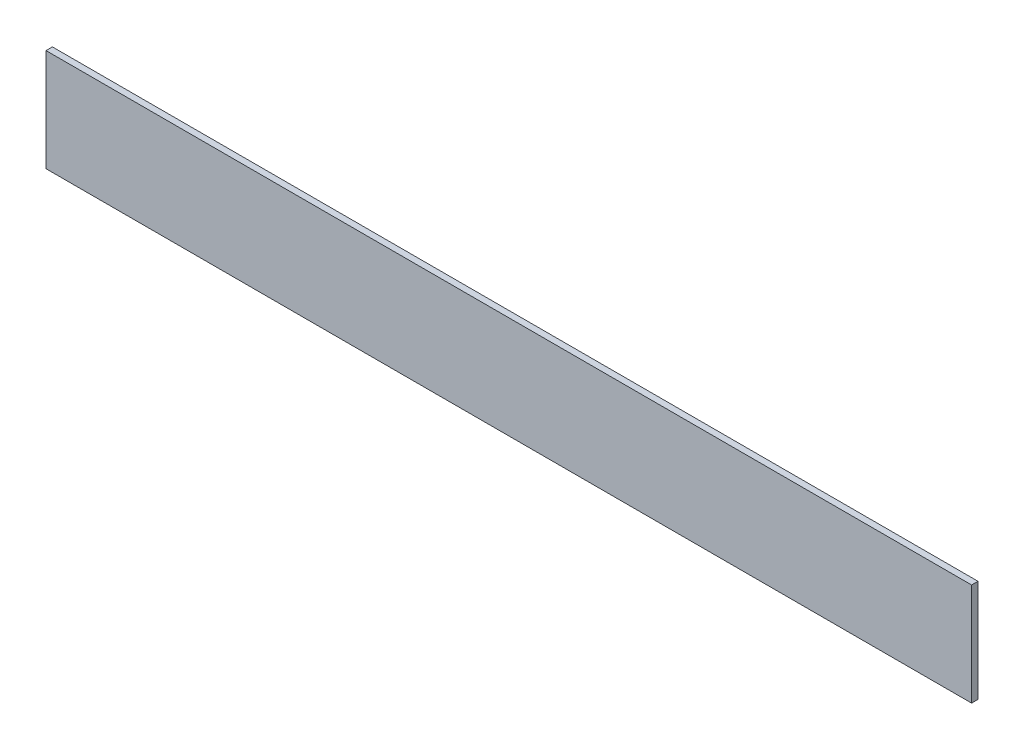
ISO-10303-21;
HEADER;
FILE_DESCRIPTION(('STEP AP214'),'2;1');
FILE_NAME('part.step','',(''),(''),'','','');
FILE_SCHEMA(('AUTOMOTIVE_DESIGN { 1 0 10303 214 1 1 1 1 }'));
ENDSEC;
DATA;
#1=APPLICATION_CONTEXT('core data for automotive mechanical design processes');
#2=APPLICATION_PROTOCOL_DEFINITION('international standard','automotive_design',2000,#1);
#3=PRODUCT_CONTEXT('',#1,'mechanical');
#4=PRODUCT('Part','Part','',(#3));
#5=PRODUCT_RELATED_PRODUCT_CATEGORY('part','',(#4));
#6=PRODUCT_DEFINITION_FORMATION('','',#4);
#7=PRODUCT_DEFINITION_CONTEXT('part definition',#1,'design');
#8=PRODUCT_DEFINITION('design','',#6,#7);
#9=PRODUCT_DEFINITION_SHAPE('','',#8);
#10=(LENGTH_UNIT() NAMED_UNIT(*) SI_UNIT(.MILLI.,.METRE.));
#11=(NAMED_UNIT(*) PLANE_ANGLE_UNIT() SI_UNIT($,.RADIAN.));
#12=(NAMED_UNIT(*) SI_UNIT($,.STERADIAN.) SOLID_ANGLE_UNIT());
#13=UNCERTAINTY_MEASURE_WITH_UNIT(LENGTH_MEASURE(1.E-05),#10,'distance_accuracy_value','');
#14=(GEOMETRIC_REPRESENTATION_CONTEXT(3) GLOBAL_UNCERTAINTY_ASSIGNED_CONTEXT((#13)) GLOBAL_UNIT_ASSIGNED_CONTEXT((#10,
#11,#12)) REPRESENTATION_CONTEXT('',''));
#15=CARTESIAN_POINT('',(0.,0.,0.));
#16=DIRECTION('',(0.,0.,1.));
#17=DIRECTION('',(1.,0.,0.));
#18=AXIS2_PLACEMENT_3D('',#15,#16,#17);
#19=CARTESIAN_POINT('',(229.745,25.4,3.175));
#20=DIRECTION('',(-1.,0.,0.));
#21=DIRECTION('',(0.,0.,1.));
#22=AXIS2_PLACEMENT_3D('',#19,#20,#21);
#23=PLANE('',#22);
#24=DIRECTION('',(0.,1.,0.));
#25=VECTOR('',#24,1.);
#26=CARTESIAN_POINT('',(229.745,25.4,0.));
#27=LINE('',#26,#25);
#28=CARTESIAN_POINT('',(229.745,-25.4,0.));
#29=VERTEX_POINT('',#28);
#30=CARTESIAN_POINT('',(229.745,25.4,0.));
#31=VERTEX_POINT('',#30);
#32=EDGE_CURVE('E104',#29,#31,#27,.T.);
#33=ORIENTED_EDGE('',*,*,#32,.T.);
#34=DIRECTION('',(0.,0.,-1.));
#35=VECTOR('',#34,1.);
#36=CARTESIAN_POINT('',(229.745,25.4,3.175));
#37=LINE('',#36,#35);
#38=CARTESIAN_POINT('',(229.745,25.4,3.175));
#39=VERTEX_POINT('',#38);
#40=EDGE_CURVE('E11',#39,#31,#37,.T.);
#41=ORIENTED_EDGE('',*,*,#40,.F.);
#42=DIRECTION('',(0.,1.,0.));
#43=VECTOR('',#42,1.);
#44=CARTESIAN_POINT('',(229.745,25.4,3.175));
#45=LINE('',#44,#43);
#46=CARTESIAN_POINT('',(229.745,-25.4,3.175));
#47=VERTEX_POINT('',#46);
#48=EDGE_CURVE('E92',#47,#39,#45,.T.);
#49=ORIENTED_EDGE('',*,*,#48,.F.);
#50=DIRECTION('',(0.,0.,-1.));
#51=VECTOR('',#50,1.);
#52=CARTESIAN_POINT('',(229.745,-25.4,3.175));
#53=LINE('',#52,#51);
#54=EDGE_CURVE('E100',#47,#29,#53,.T.);
#55=ORIENTED_EDGE('',*,*,#54,.T.);
#56=EDGE_LOOP('',(#33,#41,#49,#55));
#57=FACE_BOUND('',#56,.T.);
#58=ADVANCED_FACE('F41',(#57),#23,.F.);
#59=CARTESIAN_POINT('',(-229.745,25.4,3.175));
#60=DIRECTION('',(0.,-1.,0.));
#61=DIRECTION('',(0.,0.,-1.));
#62=AXIS2_PLACEMENT_3D('',#59,#60,#61);
#63=PLANE('',#62);
#64=DIRECTION('',(-1.,0.,0.));
#65=VECTOR('',#64,1.);
#66=CARTESIAN_POINT('',(-229.745,25.4,0.));
#67=LINE('',#66,#65);
#68=CARTESIAN_POINT('',(-229.745,25.4,0.));
#69=VERTEX_POINT('',#68);
#70=EDGE_CURVE('E96',#31,#69,#67,.T.);
#71=ORIENTED_EDGE('',*,*,#70,.T.);
#72=DIRECTION('',(0.,0.,-1.));
#73=VECTOR('',#72,1.);
#74=CARTESIAN_POINT('',(-229.745,25.4,3.175));
#75=LINE('',#74,#73);
#76=CARTESIAN_POINT('',(-229.745,25.4,3.175));
#77=VERTEX_POINT('',#76);
#78=EDGE_CURVE('E49',#77,#69,#75,.T.);
#79=ORIENTED_EDGE('',*,*,#78,.F.);
#80=DIRECTION('',(-1.,0.,0.));
#81=VECTOR('',#80,1.);
#82=CARTESIAN_POINT('',(-229.745,25.4,3.175));
#83=LINE('',#82,#81);
#84=EDGE_CURVE('E87',#39,#77,#83,.T.);
#85=ORIENTED_EDGE('',*,*,#84,.F.);
#86=ORIENTED_EDGE('',*,*,#40,.T.);
#87=EDGE_LOOP('',(#71,#79,#85,#86));
#88=FACE_BOUND('',#87,.T.);
#89=ADVANCED_FACE('F95',(#88),#63,.F.);
#90=CARTESIAN_POINT('',(-229.745,25.4,3.175));
#91=DIRECTION('',(1.,0.,0.));
#92=DIRECTION('',(0.,0.,-1.));
#93=AXIS2_PLACEMENT_3D('',#90,#91,#92);
#94=PLANE('',#93);
#95=DIRECTION('',(0.,-1.,0.));
#96=VECTOR('',#95,1.);
#97=CARTESIAN_POINT('',(-229.745,25.4,0.));
#98=LINE('',#97,#96);
#99=CARTESIAN_POINT('',(-229.745,-25.4,0.));
#100=VERTEX_POINT('',#99);
#101=EDGE_CURVE('E74',#69,#100,#98,.T.);
#102=ORIENTED_EDGE('',*,*,#101,.T.);
#103=DIRECTION('',(0.,0.,-1.));
#104=VECTOR('',#103,1.);
#105=CARTESIAN_POINT('',(-229.745,-25.4,3.175));
#106=LINE('',#105,#104);
#107=CARTESIAN_POINT('',(-229.745,-25.4,3.175));
#108=VERTEX_POINT('',#107);
#109=EDGE_CURVE('E97',#108,#100,#106,.T.);
#110=ORIENTED_EDGE('',*,*,#109,.F.);
#111=DIRECTION('',(0.,-1.,0.));
#112=VECTOR('',#111,1.);
#113=CARTESIAN_POINT('',(-229.745,25.4,3.175));
#114=LINE('',#113,#112);
#115=EDGE_CURVE('E90',#77,#108,#114,.T.);
#116=ORIENTED_EDGE('',*,*,#115,.F.);
#117=ORIENTED_EDGE('',*,*,#78,.T.);
#118=EDGE_LOOP('',(#102,#110,#116,#117));
#119=FACE_BOUND('',#118,.T.);
#120=ADVANCED_FACE('F98',(#119),#94,.F.);
#121=CARTESIAN_POINT('',(-229.745,-25.4,3.175));
#122=DIRECTION('',(0.,1.,0.));
#123=DIRECTION('',(0.,0.,1.));
#124=AXIS2_PLACEMENT_3D('',#121,#122,#123);
#125=PLANE('',#124);
#126=DIRECTION('',(1.,0.,0.));
#127=VECTOR('',#126,1.);
#128=CARTESIAN_POINT('',(-229.745,-25.4,0.));
#129=LINE('',#128,#127);
#130=EDGE_CURVE('E80',#100,#29,#129,.T.);
#131=ORIENTED_EDGE('',*,*,#130,.T.);
#132=ORIENTED_EDGE('',*,*,#54,.F.);
#133=DIRECTION('',(1.,0.,0.));
#134=VECTOR('',#133,1.);
#135=CARTESIAN_POINT('',(-229.745,-25.4,3.175));
#136=LINE('',#135,#134);
#137=EDGE_CURVE('E57',#108,#47,#136,.T.);
#138=ORIENTED_EDGE('',*,*,#137,.F.);
#139=ORIENTED_EDGE('',*,*,#109,.T.);
#140=EDGE_LOOP('',(#131,#132,#138,#139));
#141=FACE_BOUND('',#140,.T.);
#142=ADVANCED_FACE('F111',(#141),#125,.F.);
#143=CARTESIAN_POINT('',(0.,0.,3.175));
#144=DIRECTION('',(0.,0.,1.));
#145=DIRECTION('',(1.,0.,0.));
#146=AXIS2_PLACEMENT_3D('',#143,#144,#145);
#147=PLANE('',#146);
#148=ORIENTED_EDGE('',*,*,#48,.T.);
#149=ORIENTED_EDGE('',*,*,#84,.T.);
#150=ORIENTED_EDGE('',*,*,#115,.T.);
#151=ORIENTED_EDGE('',*,*,#137,.T.);
#152=EDGE_LOOP('',(#148,#149,#150,#151));
#153=FACE_BOUND('',#152,.T.);
#154=ADVANCED_FACE('F88',(#153),#147,.T.);
#155=CARTESIAN_POINT('',(0.,0.,0.));
#156=DIRECTION('',(0.,0.,1.));
#157=DIRECTION('',(1.,0.,0.));
#158=AXIS2_PLACEMENT_3D('',#155,#156,#157);
#159=PLANE('',#158);
#160=ORIENTED_EDGE('',*,*,#32,.F.);
#161=ORIENTED_EDGE('',*,*,#130,.F.);
#162=ORIENTED_EDGE('',*,*,#101,.F.);
#163=ORIENTED_EDGE('',*,*,#70,.F.);
#164=EDGE_LOOP('',(#160,#161,#162,#163));
#165=FACE_BOUND('',#164,.T.);
#166=ADVANCED_FACE('F114',(#165),#159,.F.);
#167=CLOSED_SHELL('',(#58,#89,#120,#142,#154,#166));
#168=MANIFOLD_SOLID_BREP('B2',#167);
#169=ADVANCED_BREP_SHAPE_REPRESENTATION('',(#18,#168),#14);
#170=SHAPE_DEFINITION_REPRESENTATION(#9,#169);
ENDSEC;
END-ISO-10303-21;
